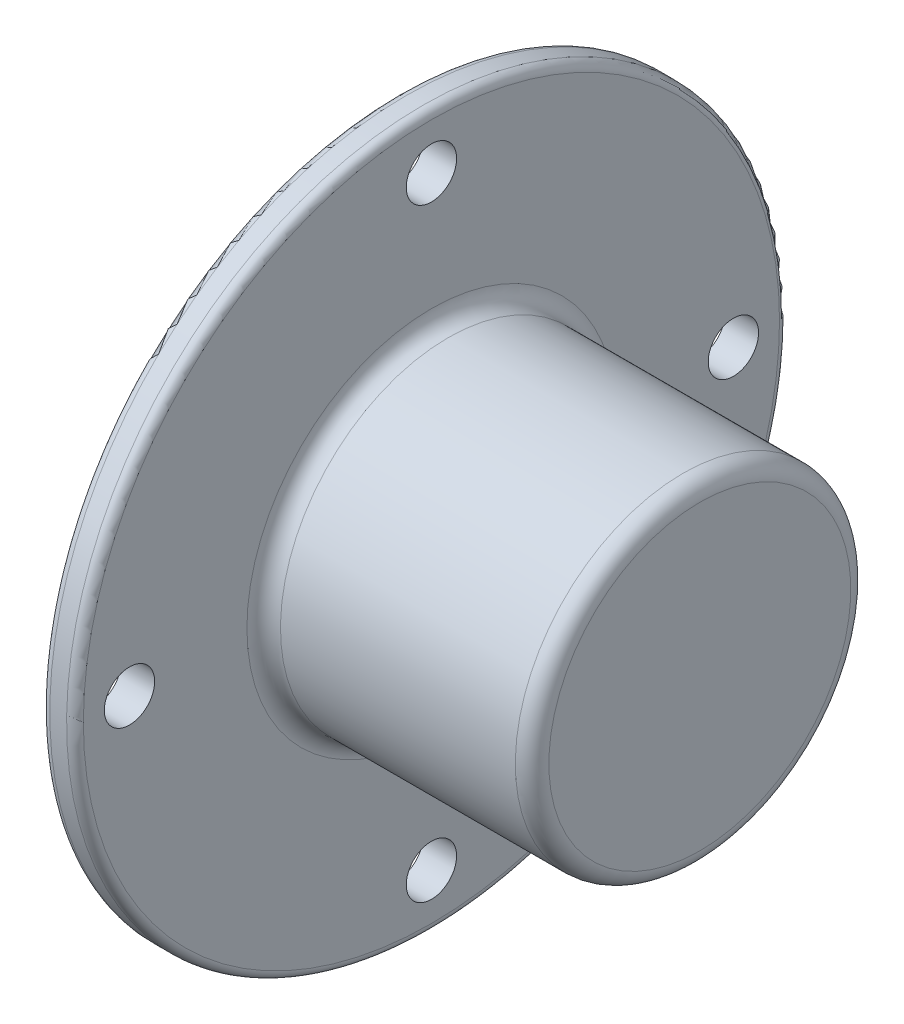
ISO-10303-21;
HEADER;
FILE_DESCRIPTION(('STEP AP214'),'2;1');
FILE_NAME('part.step','',(''),(''),'','','');
FILE_SCHEMA(('AUTOMOTIVE_DESIGN { 1 0 10303 214 1 1 1 1 }'));
ENDSEC;
DATA;
#1=APPLICATION_CONTEXT('core data for automotive mechanical design processes');
#2=APPLICATION_PROTOCOL_DEFINITION('international standard','automotive_design',2000,#1);
#3=PRODUCT_CONTEXT('',#1,'mechanical');
#4=PRODUCT('Part','Part','',(#3));
#5=PRODUCT_RELATED_PRODUCT_CATEGORY('part','',(#4));
#6=PRODUCT_DEFINITION_FORMATION('','',#4);
#7=PRODUCT_DEFINITION_CONTEXT('part definition',#1,'design');
#8=PRODUCT_DEFINITION('design','',#6,#7);
#9=PRODUCT_DEFINITION_SHAPE('','',#8);
#10=(LENGTH_UNIT() NAMED_UNIT(*) SI_UNIT(.MILLI.,.METRE.));
#11=(NAMED_UNIT(*) PLANE_ANGLE_UNIT() SI_UNIT($,.RADIAN.));
#12=(NAMED_UNIT(*) SI_UNIT($,.STERADIAN.) SOLID_ANGLE_UNIT());
#13=UNCERTAINTY_MEASURE_WITH_UNIT(LENGTH_MEASURE(1.E-05),#10,'distance_accuracy_value','');
#14=(GEOMETRIC_REPRESENTATION_CONTEXT(3) GLOBAL_UNCERTAINTY_ASSIGNED_CONTEXT((#13)) GLOBAL_UNIT_ASSIGNED_CONTEXT((#10,
#11,#12)) REPRESENTATION_CONTEXT('',''));
#15=CARTESIAN_POINT('',(0.,0.,0.));
#16=DIRECTION('',(0.,0.,1.));
#17=DIRECTION('',(1.,0.,0.));
#18=AXIS2_PLACEMENT_3D('',#15,#16,#17);
#19=CARTESIAN_POINT('',(0.,0.,0.));
#20=DIRECTION('',(-1.,0.,0.));
#21=DIRECTION('',(0.,-1.,0.));
#22=AXIS2_PLACEMENT_3D('',#19,#20,#21);
#23=PLANE('',#22);
#24=CARTESIAN_POINT('',(0.,0.,0.));
#25=DIRECTION('',(-1.,0.,0.));
#26=DIRECTION('',(0.,-1.,0.));
#27=AXIS2_PLACEMENT_3D('',#24,#25,#26);
#28=CIRCLE('',#27,20.75);
#29=CARTESIAN_POINT('',(0.,-20.75,0.));
#30=VERTEX_POINT('',#29);
#31=EDGE_CURVE('E59',#30,#30,#28,.T.);
#32=ORIENTED_EDGE('',*,*,#31,.T.);
#33=EDGE_LOOP('',(#32));
#34=FACE_BOUND('',#33,.T.);
#35=CARTESIAN_POINT('',(0.,0.,18.));
#36=DIRECTION('',(-1.,0.,0.));
#37=DIRECTION('',(0.,-1.,0.));
#38=AXIS2_PLACEMENT_3D('',#35,#36,#37);
#39=CIRCLE('',#38,1.5);
#40=CARTESIAN_POINT('',(0.,-1.50000000000006,18.));
#41=VERTEX_POINT('',#40);
#42=EDGE_CURVE('E90',#41,#41,#39,.F.);
#43=ORIENTED_EDGE('',*,*,#42,.T.);
#44=EDGE_LOOP('',(#43));
#45=FACE_BOUND('',#44,.T.);
#46=CARTESIAN_POINT('',(0.,-18.,0.));
#47=DIRECTION('',(-1.,0.,0.));
#48=DIRECTION('',(0.,-1.,0.));
#49=AXIS2_PLACEMENT_3D('',#46,#47,#48);
#50=CIRCLE('',#49,1.5);
#51=CARTESIAN_POINT('',(0.,-19.5,0.));
#52=VERTEX_POINT('',#51);
#53=EDGE_CURVE('E84',#52,#52,#50,.F.);
#54=ORIENTED_EDGE('',*,*,#53,.T.);
#55=EDGE_LOOP('',(#54));
#56=FACE_BOUND('',#55,.T.);
#57=CARTESIAN_POINT('',(0.,1.88539992297529E-13,-18.));
#58=DIRECTION('',(-1.,0.,0.));
#59=DIRECTION('',(0.,-1.,0.));
#60=AXIS2_PLACEMENT_3D('',#57,#58,#59);
#61=CIRCLE('',#60,1.5);
#62=CARTESIAN_POINT('',(0.,-1.49999999999981,-18.));
#63=VERTEX_POINT('',#62);
#64=EDGE_CURVE('E78',#63,#63,#61,.F.);
#65=ORIENTED_EDGE('',*,*,#64,.T.);
#66=EDGE_LOOP('',(#65));
#67=FACE_BOUND('',#66,.T.);
#68=CARTESIAN_POINT('',(0.,18.,0.));
#69=DIRECTION('',(-1.,0.,0.));
#70=DIRECTION('',(0.,-1.,0.));
#71=AXIS2_PLACEMENT_3D('',#68,#69,#70);
#72=CIRCLE('',#71,1.5);
#73=CARTESIAN_POINT('',(0.,16.5,0.));
#74=VERTEX_POINT('',#73);
#75=EDGE_CURVE('E72',#74,#74,#72,.F.);
#76=ORIENTED_EDGE('',*,*,#75,.T.);
#77=EDGE_LOOP('',(#76));
#78=FACE_BOUND('',#77,.T.);
#79=ADVANCED_FACE('F39',(#34,#45,#56,#67,#78),#23,.T.);
#80=CARTESIAN_POINT('',(18.,0.,0.));
#81=DIRECTION('',(1.,0.,0.));
#82=DIRECTION('',(0.,1.,0.));
#83=AXIS2_PLACEMENT_3D('',#80,#81,#82);
#84=CYLINDRICAL_SURFACE('',#83,21.25);
#85=CARTESIAN_POINT('',(1.5,0.,0.));
#86=DIRECTION('',(1.,0.,0.));
#87=DIRECTION('',(0.,1.,0.));
#88=AXIS2_PLACEMENT_3D('',#85,#86,#87);
#89=CIRCLE('',#88,21.25);
#90=CARTESIAN_POINT('',(1.5,21.25,0.));
#91=VERTEX_POINT('',#90);
#92=EDGE_CURVE('E62',#91,#91,#89,.F.);
#93=ORIENTED_EDGE('',*,*,#92,.T.);
#94=EDGE_LOOP('',(#93));
#95=FACE_BOUND('',#94,.T.);
#96=CARTESIAN_POINT('',(0.5,0.,0.));
#97=DIRECTION('',(-1.,0.,0.));
#98=DIRECTION('',(0.,-1.,0.));
#99=AXIS2_PLACEMENT_3D('',#96,#97,#98);
#100=CIRCLE('',#99,21.25);
#101=CARTESIAN_POINT('',(0.500000000000001,-21.25,0.));
#102=VERTEX_POINT('',#101);
#103=EDGE_CURVE('E65',#102,#102,#100,.F.);
#104=ORIENTED_EDGE('',*,*,#103,.T.);
#105=EDGE_LOOP('',(#104));
#106=FACE_BOUND('',#105,.T.);
#107=ADVANCED_FACE('F102',(#95,#106),#84,.T.);
#108=CARTESIAN_POINT('',(2.,21.25,0.));
#109=DIRECTION('',(1.,0.,0.));
#110=DIRECTION('',(0.,1.,0.));
#111=AXIS2_PLACEMENT_3D('',#108,#109,#110);
#112=PLANE('',#111);
#113=CARTESIAN_POINT('',(2.,0.,0.));
#114=DIRECTION('',(1.,0.,0.));
#115=DIRECTION('',(0.,1.,0.));
#116=AXIS2_PLACEMENT_3D('',#113,#114,#115);
#117=CIRCLE('',#116,11.);
#118=CARTESIAN_POINT('',(2.,11.,0.));
#119=VERTEX_POINT('',#118);
#120=EDGE_CURVE('E10',#119,#119,#117,.F.);
#121=ORIENTED_EDGE('',*,*,#120,.T.);
#122=EDGE_LOOP('',(#121));
#123=FACE_BOUND('',#122,.T.);
#124=CARTESIAN_POINT('',(2.,0.,0.));
#125=DIRECTION('',(1.,0.,0.));
#126=DIRECTION('',(0.,1.,0.));
#127=AXIS2_PLACEMENT_3D('',#124,#125,#126);
#128=CIRCLE('',#127,20.75);
#129=CARTESIAN_POINT('',(2.,20.75,0.));
#130=VERTEX_POINT('',#129);
#131=EDGE_CURVE('E68',#130,#130,#128,.T.);
#132=ORIENTED_EDGE('',*,*,#131,.T.);
#133=EDGE_LOOP('',(#132));
#134=FACE_BOUND('',#133,.T.);
#135=CARTESIAN_POINT('',(2.,0.,18.));
#136=DIRECTION('',(1.,0.,0.));
#137=DIRECTION('',(0.,0.,1.));
#138=AXIS2_PLACEMENT_3D('',#135,#136,#137);
#139=CIRCLE('',#138,1.5);
#140=CARTESIAN_POINT('',(2.,0.,19.5));
#141=VERTEX_POINT('',#140);
#142=EDGE_CURVE('E75',#141,#141,#139,.T.);
#143=ORIENTED_EDGE('',*,*,#142,.F.);
#144=EDGE_LOOP('',(#143));
#145=FACE_BOUND('',#144,.T.);
#146=CARTESIAN_POINT('',(2.,-18.,0.));
#147=DIRECTION('',(1.,0.,0.));
#148=DIRECTION('',(0.,-1.,0.));
#149=AXIS2_PLACEMENT_3D('',#146,#147,#148);
#150=CIRCLE('',#149,1.5);
#151=CARTESIAN_POINT('',(2.,-19.5,0.));
#152=VERTEX_POINT('',#151);
#153=EDGE_CURVE('E87',#152,#152,#150,.T.);
#154=ORIENTED_EDGE('',*,*,#153,.F.);
#155=EDGE_LOOP('',(#154));
#156=FACE_BOUND('',#155,.T.);
#157=CARTESIAN_POINT('',(2.,1.88553599484186E-13,-18.));
#158=DIRECTION('',(1.,0.,0.));
#159=DIRECTION('',(0.,0.,-1.));
#160=AXIS2_PLACEMENT_3D('',#157,#158,#159);
#161=CIRCLE('',#160,1.5);
#162=CARTESIAN_POINT('',(2.,2.0426526550898E-13,-19.5));
#163=VERTEX_POINT('',#162);
#164=EDGE_CURVE('E81',#163,#163,#161,.T.);
#165=ORIENTED_EDGE('',*,*,#164,.F.);
#166=EDGE_LOOP('',(#165));
#167=FACE_BOUND('',#166,.T.);
#168=CARTESIAN_POINT('',(2.,18.,0.));
#169=DIRECTION('',(1.,0.,0.));
#170=DIRECTION('',(0.,1.,0.));
#171=AXIS2_PLACEMENT_3D('',#168,#169,#170);
#172=CIRCLE('',#171,1.5);
#173=CARTESIAN_POINT('',(2.,19.5,0.));
#174=VERTEX_POINT('',#173);
#175=EDGE_CURVE('E71',#174,#174,#172,.T.);
#176=ORIENTED_EDGE('',*,*,#175,.F.);
#177=EDGE_LOOP('',(#176));
#178=FACE_BOUND('',#177,.T.);
#179=ADVANCED_FACE('F98',(#123,#134,#145,#156,#167,#178),#112,.T.);
#180=CARTESIAN_POINT('',(18.,0.,0.));
#181=DIRECTION('',(1.,0.,0.));
#182=DIRECTION('',(0.,1.,0.));
#183=AXIS2_PLACEMENT_3D('',#180,#181,#182);
#184=CYLINDRICAL_SURFACE('',#183,10.);
#185=CARTESIAN_POINT('',(17.,0.,0.));
#186=DIRECTION('',(1.,0.,0.));
#187=DIRECTION('',(0.,1.,0.));
#188=AXIS2_PLACEMENT_3D('',#185,#186,#187);
#189=CIRCLE('',#188,10.);
#190=CARTESIAN_POINT('',(17.,10.,0.));
#191=VERTEX_POINT('',#190);
#192=EDGE_CURVE('E46',#191,#191,#189,.F.);
#193=ORIENTED_EDGE('',*,*,#192,.T.);
#194=EDGE_LOOP('',(#193));
#195=FACE_BOUND('',#194,.T.);
#196=CARTESIAN_POINT('',(3.,0.,0.));
#197=DIRECTION('',(1.,0.,0.));
#198=DIRECTION('',(0.,1.,0.));
#199=AXIS2_PLACEMENT_3D('',#196,#197,#198);
#200=CIRCLE('',#199,10.);
#201=CARTESIAN_POINT('',(3.,10.,0.));
#202=VERTEX_POINT('',#201);
#203=EDGE_CURVE('E50',#202,#202,#200,.T.);
#204=ORIENTED_EDGE('',*,*,#203,.T.);
#205=EDGE_LOOP('',(#204));
#206=FACE_BOUND('',#205,.T.);
#207=ADVANCED_FACE('F101',(#195,#206),#184,.T.);
#208=CARTESIAN_POINT('',(18.,10.,0.));
#209=DIRECTION('',(1.,0.,0.));
#210=DIRECTION('',(0.,1.,0.));
#211=AXIS2_PLACEMENT_3D('',#208,#209,#210);
#212=PLANE('',#211);
#213=CARTESIAN_POINT('',(18.,0.,0.));
#214=DIRECTION('',(1.,0.,0.));
#215=DIRECTION('',(0.,1.,0.));
#216=AXIS2_PLACEMENT_3D('',#213,#214,#215);
#217=CIRCLE('',#216,9.);
#218=CARTESIAN_POINT('',(18.,9.,0.));
#219=VERTEX_POINT('',#218);
#220=EDGE_CURVE('E54',#219,#219,#217,.T.);
#221=ORIENTED_EDGE('',*,*,#220,.T.);
#222=EDGE_LOOP('',(#221));
#223=FACE_BOUND('',#222,.T.);
#224=ADVANCED_FACE('F113',(#223),#212,.T.);
#225=CARTESIAN_POINT('',(-0.00100000000000013,18.,0.));
#226=DIRECTION('',(1.,0.,0.));
#227=DIRECTION('',(0.,1.,0.));
#228=AXIS2_PLACEMENT_3D('',#225,#226,#227);
#229=CYLINDRICAL_SURFACE('',#228,1.5);
#230=ORIENTED_EDGE('',*,*,#75,.F.);
#231=EDGE_LOOP('',(#230));
#232=FACE_BOUND('',#231,.T.);
#233=ORIENTED_EDGE('',*,*,#175,.T.);
#234=EDGE_LOOP('',(#233));
#235=FACE_BOUND('',#234,.T.);
#236=ADVANCED_FACE('F110',(#232,#235),#229,.F.);
#237=CARTESIAN_POINT('',(-0.00100000000000013,1.88539985493936E-13,-18.));
#238=DIRECTION('',(1.,0.,0.));
#239=DIRECTION('',(0.,0.,-1.));
#240=AXIS2_PLACEMENT_3D('',#237,#238,#239);
#241=CYLINDRICAL_SURFACE('',#240,1.5);
#242=ORIENTED_EDGE('',*,*,#64,.F.);
#243=EDGE_LOOP('',(#242));
#244=FACE_BOUND('',#243,.T.);
#245=ORIENTED_EDGE('',*,*,#164,.T.);
#246=EDGE_LOOP('',(#245));
#247=FACE_BOUND('',#246,.T.);
#248=ADVANCED_FACE('F112',(#244,#247),#241,.F.);
#249=CARTESIAN_POINT('',(-0.00100000000000013,-18.,0.));
#250=DIRECTION('',(1.,0.,0.));
#251=DIRECTION('',(0.,1.,0.));
#252=AXIS2_PLACEMENT_3D('',#249,#250,#251);
#253=CYLINDRICAL_SURFACE('',#252,1.5);
#254=ORIENTED_EDGE('',*,*,#53,.F.);
#255=EDGE_LOOP('',(#254));
#256=FACE_BOUND('',#255,.T.);
#257=ORIENTED_EDGE('',*,*,#153,.T.);
#258=EDGE_LOOP('',(#257));
#259=FACE_BOUND('',#258,.T.);
#260=ADVANCED_FACE('F119',(#256,#259),#253,.F.);
#261=CARTESIAN_POINT('',(-0.00100000000000013,0.,18.));
#262=DIRECTION('',(1.,0.,0.));
#263=DIRECTION('',(0.,0.,-1.));
#264=AXIS2_PLACEMENT_3D('',#261,#262,#263);
#265=CYLINDRICAL_SURFACE('',#264,1.5);
#266=ORIENTED_EDGE('',*,*,#42,.F.);
#267=EDGE_LOOP('',(#266));
#268=FACE_BOUND('',#267,.T.);
#269=ORIENTED_EDGE('',*,*,#142,.T.);
#270=EDGE_LOOP('',(#269));
#271=FACE_BOUND('',#270,.T.);
#272=ADVANCED_FACE('F96',(#268,#271),#265,.F.);
#273=CARTESIAN_POINT('',(1.5,0.,0.));
#274=DIRECTION('',(1.,0.,0.));
#275=DIRECTION('',(0.,1.,0.));
#276=AXIS2_PLACEMENT_3D('',#273,#274,#275);
#277=TOROIDAL_SURFACE('',#276,20.75,0.5);
#278=ORIENTED_EDGE('',*,*,#92,.F.);
#279=EDGE_LOOP('',(#278));
#280=FACE_BOUND('',#279,.T.);
#281=ORIENTED_EDGE('',*,*,#131,.F.);
#282=EDGE_LOOP('',(#281));
#283=FACE_BOUND('',#282,.T.);
#284=ADVANCED_FACE('F137',(#280,#283),#277,.T.);
#285=CARTESIAN_POINT('',(0.5,0.,0.));
#286=DIRECTION('',(-1.,0.,0.));
#287=DIRECTION('',(0.,-1.,0.));
#288=AXIS2_PLACEMENT_3D('',#285,#286,#287);
#289=TOROIDAL_SURFACE('',#288,20.75,0.5);
#290=ORIENTED_EDGE('',*,*,#31,.F.);
#291=EDGE_LOOP('',(#290));
#292=FACE_BOUND('',#291,.T.);
#293=ORIENTED_EDGE('',*,*,#103,.F.);
#294=EDGE_LOOP('',(#293));
#295=FACE_BOUND('',#294,.T.);
#296=ADVANCED_FACE('F140',(#292,#295),#289,.T.);
#297=CARTESIAN_POINT('',(17.,0.,0.));
#298=DIRECTION('',(1.,0.,0.));
#299=DIRECTION('',(0.,1.,0.));
#300=AXIS2_PLACEMENT_3D('',#297,#298,#299);
#301=TOROIDAL_SURFACE('',#300,9.,1.);
#302=ORIENTED_EDGE('',*,*,#192,.F.);
#303=EDGE_LOOP('',(#302));
#304=FACE_BOUND('',#303,.T.);
#305=ORIENTED_EDGE('',*,*,#220,.F.);
#306=EDGE_LOOP('',(#305));
#307=FACE_BOUND('',#306,.T.);
#308=ADVANCED_FACE('F143',(#304,#307),#301,.T.);
#309=CARTESIAN_POINT('',(3.,0.,0.));
#310=DIRECTION('',(1.,0.,0.));
#311=DIRECTION('',(0.,1.,0.));
#312=AXIS2_PLACEMENT_3D('',#309,#310,#311);
#313=TOROIDAL_SURFACE('',#312,11.,1.);
#314=ORIENTED_EDGE('',*,*,#120,.F.);
#315=EDGE_LOOP('',(#314));
#316=FACE_BOUND('',#315,.T.);
#317=ORIENTED_EDGE('',*,*,#203,.F.);
#318=EDGE_LOOP('',(#317));
#319=FACE_BOUND('',#318,.T.);
#320=ADVANCED_FACE('F41',(#316,#319),#313,.F.);
#321=CLOSED_SHELL('',(#79,#107,#179,#207,#224,#236,#248,#260,#272,#284,#296,#308,#320));
#322=MANIFOLD_SOLID_BREP('B2',#321);
#323=ADVANCED_BREP_SHAPE_REPRESENTATION('',(#18,#322),#14);
#324=SHAPE_DEFINITION_REPRESENTATION(#9,#323);
ENDSEC;
END-ISO-10303-21;
